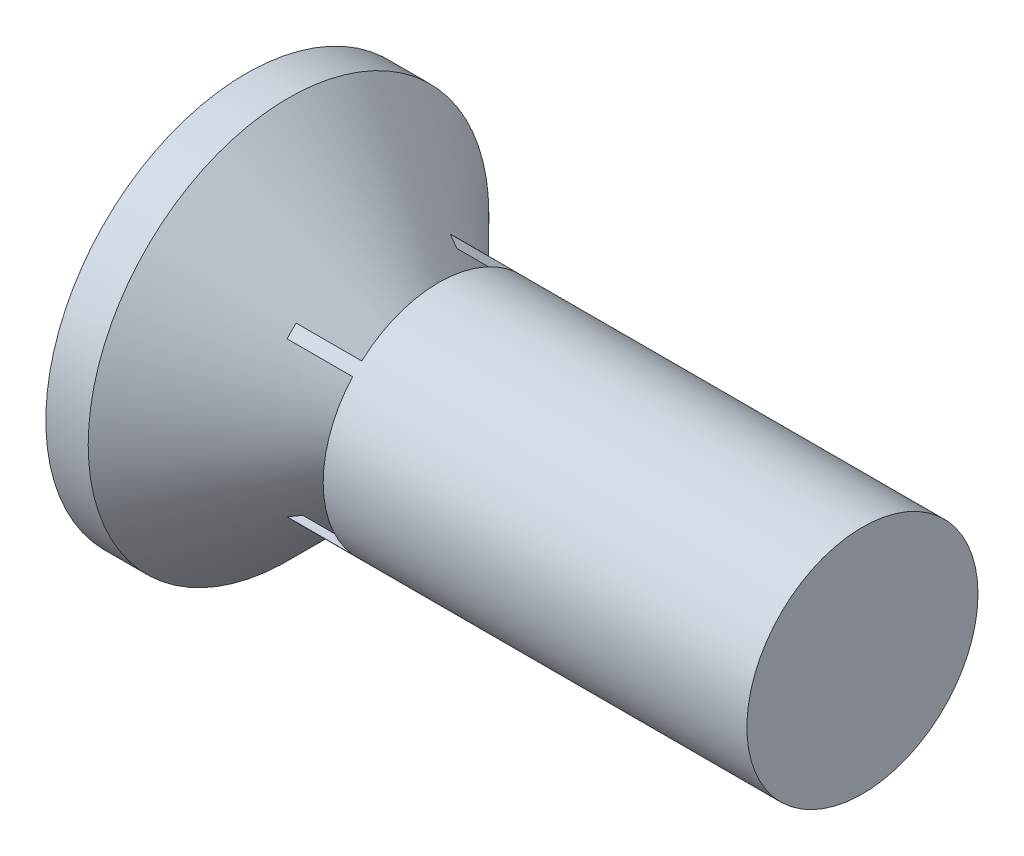
ISO-10303-21;
HEADER;
FILE_DESCRIPTION(('STEP AP214'),'2;1');
FILE_NAME('part.step','',(''),(''),'','','');
FILE_SCHEMA(('AUTOMOTIVE_DESIGN { 1 0 10303 214 1 1 1 1 }'));
ENDSEC;
DATA;
#1=APPLICATION_CONTEXT('core data for automotive mechanical design processes');
#2=APPLICATION_PROTOCOL_DEFINITION('international standard','automotive_design',2000,#1);
#3=PRODUCT_CONTEXT('',#1,'mechanical');
#4=PRODUCT('Part','Part','',(#3));
#5=PRODUCT_RELATED_PRODUCT_CATEGORY('part','',(#4));
#6=PRODUCT_DEFINITION_FORMATION('','',#4);
#7=PRODUCT_DEFINITION_CONTEXT('part definition',#1,'design');
#8=PRODUCT_DEFINITION('design','',#6,#7);
#9=PRODUCT_DEFINITION_SHAPE('','',#8);
#10=(LENGTH_UNIT() NAMED_UNIT(*) SI_UNIT(.MILLI.,.METRE.));
#11=(NAMED_UNIT(*) PLANE_ANGLE_UNIT() SI_UNIT($,.RADIAN.));
#12=(NAMED_UNIT(*) SI_UNIT($,.STERADIAN.) SOLID_ANGLE_UNIT());
#13=UNCERTAINTY_MEASURE_WITH_UNIT(LENGTH_MEASURE(1.E-05),#10,'distance_accuracy_value','');
#14=(GEOMETRIC_REPRESENTATION_CONTEXT(3) GLOBAL_UNCERTAINTY_ASSIGNED_CONTEXT((#13)) GLOBAL_UNIT_ASSIGNED_CONTEXT((#10,
#11,#12)) REPRESENTATION_CONTEXT('',''));
#15=CARTESIAN_POINT('',(0.,0.,0.));
#16=DIRECTION('',(0.,0.,1.));
#17=DIRECTION('',(1.,0.,0.));
#18=AXIS2_PLACEMENT_3D('',#15,#16,#17);
#19=CARTESIAN_POINT('',(2.5,1.,1.));
#20=DIRECTION('',(1.,0.,0.));
#21=DIRECTION('',(0.,0.,-1.));
#22=AXIS2_PLACEMENT_3D('',#19,#20,#21);
#23=PLANE('',#22);
#24=DIRECTION('',(0.,1.,0.));
#25=VECTOR('',#24,1.);
#26=CARTESIAN_POINT('',(2.5,1.,0.999999999999999));
#27=LINE('',#26,#25);
#28=CARTESIAN_POINT('',(2.5,-1.00000000000001,0.999999999999999));
#29=VERTEX_POINT('',#28);
#30=CARTESIAN_POINT('',(2.5,-1.1180339887499,0.999999999999999));
#31=VERTEX_POINT('',#30);
#32=EDGE_CURVE('E578',#29,#31,#27,.F.);
#33=ORIENTED_EDGE('',*,*,#32,.F.);
#34=DIRECTION('',(0.,0.,-1.));
#35=VECTOR('',#34,1.);
#36=CARTESIAN_POINT('',(2.5,-1.,1.));
#37=LINE('',#36,#35);
#38=CARTESIAN_POINT('',(2.5,-1.,1.11803398874989));
#39=VERTEX_POINT('',#38);
#40=EDGE_CURVE('E581',#39,#29,#37,.T.);
#41=ORIENTED_EDGE('',*,*,#40,.F.);
#42=CARTESIAN_POINT('',(2.5,0.,0.));
#43=DIRECTION('',(1.,0.,0.));
#44=DIRECTION('',(0.,0.,-1.));
#45=AXIS2_PLACEMENT_3D('',#42,#43,#44);
#46=CIRCLE('',#45,1.5);
#47=CARTESIAN_POINT('',(2.5,1.,1.11803398874989));
#48=VERTEX_POINT('',#47);
#49=EDGE_CURVE('E348',#48,#39,#46,.T.);
#50=ORIENTED_EDGE('',*,*,#49,.F.);
#51=DIRECTION('',(0.,0.,-1.));
#52=VECTOR('',#51,1.);
#53=CARTESIAN_POINT('',(2.5,1.,1.));
#54=LINE('',#53,#52);
#55=CARTESIAN_POINT('',(2.5,1.,1.00000000000021));
#56=VERTEX_POINT('',#55);
#57=EDGE_CURVE('E585',#56,#48,#54,.F.);
#58=ORIENTED_EDGE('',*,*,#57,.F.);
#59=DIRECTION('',(0.,1.,0.));
#60=VECTOR('',#59,1.);
#61=CARTESIAN_POINT('',(2.5,1.,1.));
#62=LINE('',#61,#60);
#63=CARTESIAN_POINT('',(2.5,1.11803398874989,1.));
#64=VERTEX_POINT('',#63);
#65=EDGE_CURVE('E590',#64,#56,#62,.F.);
#66=ORIENTED_EDGE('',*,*,#65,.F.);
#67=CARTESIAN_POINT('',(2.5,0.,0.));
#68=DIRECTION('',(1.,0.,0.));
#69=DIRECTION('',(0.,0.,-1.));
#70=AXIS2_PLACEMENT_3D('',#67,#68,#69);
#71=CIRCLE('',#70,1.5);
#72=CARTESIAN_POINT('',(2.5,1.11803398874989,-1.));
#73=VERTEX_POINT('',#72);
#74=EDGE_CURVE('E353',#73,#64,#71,.T.);
#75=ORIENTED_EDGE('',*,*,#74,.F.);
#76=DIRECTION('',(0.,1.,0.));
#77=VECTOR('',#76,1.);
#78=CARTESIAN_POINT('',(2.5,1.,-1.));
#79=LINE('',#78,#77);
#80=CARTESIAN_POINT('',(2.5,1.00000000000013,-1.));
#81=VERTEX_POINT('',#80);
#82=EDGE_CURVE('E594',#81,#73,#79,.T.);
#83=ORIENTED_EDGE('',*,*,#82,.F.);
#84=DIRECTION('',(0.,0.,-1.));
#85=VECTOR('',#84,1.);
#86=CARTESIAN_POINT('',(2.5,1.,1.));
#87=LINE('',#86,#85);
#88=CARTESIAN_POINT('',(2.5,1.,-1.11803398874989));
#89=VERTEX_POINT('',#88);
#90=EDGE_CURVE('E598',#89,#81,#87,.F.);
#91=ORIENTED_EDGE('',*,*,#90,.F.);
#92=CARTESIAN_POINT('',(2.5,0.,0.));
#93=DIRECTION('',(1.,0.,0.));
#94=DIRECTION('',(0.,0.,-1.));
#95=AXIS2_PLACEMENT_3D('',#92,#93,#94);
#96=CIRCLE('',#95,1.5);
#97=CARTESIAN_POINT('',(2.5,-1.,-1.11803398874989));
#98=VERTEX_POINT('',#97);
#99=EDGE_CURVE('E358',#98,#89,#96,.T.);
#100=ORIENTED_EDGE('',*,*,#99,.F.);
#101=DIRECTION('',(0.,0.,1.));
#102=VECTOR('',#101,1.);
#103=CARTESIAN_POINT('',(2.5,-1.,-1.));
#104=LINE('',#103,#102);
#105=CARTESIAN_POINT('',(2.5,-1.,-1.));
#106=VERTEX_POINT('',#105);
#107=EDGE_CURVE('E362',#106,#98,#104,.F.);
#108=ORIENTED_EDGE('',*,*,#107,.F.);
#109=DIRECTION('',(0.,-1.,0.));
#110=VECTOR('',#109,1.);
#111=CARTESIAN_POINT('',(2.5,-1.,-1.));
#112=LINE('',#111,#110);
#113=CARTESIAN_POINT('',(2.5,-1.11803398874989,-1.));
#114=VERTEX_POINT('',#113);
#115=EDGE_CURVE('E580',#114,#106,#112,.F.);
#116=ORIENTED_EDGE('',*,*,#115,.F.);
#117=CARTESIAN_POINT('',(2.5,0.,0.));
#118=DIRECTION('',(1.,0.,0.));
#119=DIRECTION('',(0.,0.,-1.));
#120=AXIS2_PLACEMENT_3D('',#117,#118,#119);
#121=CIRCLE('',#120,1.5);
#122=EDGE_CURVE('E343',#31,#114,#121,.T.);
#123=ORIENTED_EDGE('',*,*,#122,.F.);
#124=EDGE_LOOP('',(#33,#41,#50,#58,#66,#75,#83,#91,#100,#108,#116,#123));
#125=FACE_BOUND('',#124,.T.);
#126=DIRECTION('',(0.,-1.,0.));
#127=VECTOR('',#126,1.);
#128=CARTESIAN_POINT('',(2.5,1.,-0.156624327025932));
#129=LINE('',#128,#127);
#130=CARTESIAN_POINT('',(2.5,0.156624327025931,-0.156624327025932));
#131=VERTEX_POINT('',#130);
#132=CARTESIAN_POINT('',(2.5,-0.156624327025932,-0.156624327025932));
#133=VERTEX_POINT('',#132);
#134=EDGE_CURVE('E11',#131,#133,#129,.T.);
#135=ORIENTED_EDGE('',*,*,#134,.F.);
#136=DIRECTION('',(0.,0.,-1.));
#137=VECTOR('',#136,1.);
#138=CARTESIAN_POINT('',(2.5,0.156624327025931,1.));
#139=LINE('',#138,#137);
#140=CARTESIAN_POINT('',(2.5,0.156624327025931,0.156624327025932));
#141=VERTEX_POINT('',#140);
#142=EDGE_CURVE('E26',#141,#131,#139,.T.);
#143=ORIENTED_EDGE('',*,*,#142,.F.);
#144=DIRECTION('',(0.,1.,0.));
#145=VECTOR('',#144,1.);
#146=CARTESIAN_POINT('',(2.5,1.,0.156624327025932));
#147=LINE('',#146,#145);
#148=CARTESIAN_POINT('',(2.5,-0.156624327025932,0.156624327025931));
#149=VERTEX_POINT('',#148);
#150=EDGE_CURVE('E334',#149,#141,#147,.T.);
#151=ORIENTED_EDGE('',*,*,#150,.F.);
#152=DIRECTION('',(0.,0.,1.));
#153=VECTOR('',#152,1.);
#154=CARTESIAN_POINT('',(2.5,-0.156624327025932,1.));
#155=LINE('',#154,#153);
#156=EDGE_CURVE('E332',#133,#149,#155,.T.);
#157=ORIENTED_EDGE('',*,*,#156,.F.);
#158=EDGE_LOOP('',(#135,#143,#151,#157));
#159=FACE_BOUND('',#158,.T.);
#160=ADVANCED_FACE('F16',(#125,#159),#23,.F.);
#161=CARTESIAN_POINT('',(62.2289156626506,0.,0.));
#162=DIRECTION('',(1.,0.,0.));
#163=DIRECTION('',(0.,1.,0.));
#164=AXIS2_PLACEMENT_3D('',#161,#162,#163);
#165=CYLINDRICAL_SURFACE('',#164,0.999999999999985);
#166=CARTESIAN_POINT('',(2.77128129211021,0.,0.));
#167=DIRECTION('',(-0.500000000000001,0.866025403784438,0.));
#168=DIRECTION('',(0.866025403784438,0.500000000000001,0.));
#169=AXIS2_PLACEMENT_3D('',#166,#167,#168);
#170=ELLIPSE('',#169,1.99999999999997,0.999999999999985);
#171=CARTESIAN_POINT('',(1.54653642071864,-0.707106781186532,0.707106781186532));
#172=VERTEX_POINT('',#171);
#173=CARTESIAN_POINT('',(1.2,-0.907179676972447,0.420743429762272));
#174=VERTEX_POINT('',#173);
#175=EDGE_CURVE('E215',#172,#174,#170,.F.);
#176=ORIENTED_EDGE('',*,*,#175,.F.);
#177=CARTESIAN_POINT('',(2.7712812921102,0.,0.));
#178=DIRECTION('',(-0.500000000000001,0.,-0.866025403784438));
#179=DIRECTION('',(0.866025403784438,0.,-0.500000000000001));
#180=AXIS2_PLACEMENT_3D('',#177,#178,#179);
#181=ELLIPSE('',#180,1.99999999999997,0.999999999999985);
#182=CARTESIAN_POINT('',(1.2,-0.420743429762281,0.907179676972448));
#183=VERTEX_POINT('',#182);
#184=EDGE_CURVE('E169',#183,#172,#181,.F.);
#185=ORIENTED_EDGE('',*,*,#184,.F.);
#186=CARTESIAN_POINT('',(1.2,0.,0.));
#187=DIRECTION('',(1.,0.,0.));
#188=DIRECTION('',(0.,1.,0.));
#189=AXIS2_PLACEMENT_3D('',#186,#187,#188);
#190=CIRCLE('',#189,0.999999999999985);
#191=EDGE_CURVE('E159',#174,#183,#190,.F.);
#192=ORIENTED_EDGE('',*,*,#191,.F.);
#193=EDGE_LOOP('',(#176,#185,#192));
#194=FACE_BOUND('',#193,.T.);
#195=ADVANCED_FACE('F18',(#194),#165,.T.);
#196=CARTESIAN_POINT('',(62.2289156626506,0.,0.));
#197=DIRECTION('',(1.,0.,0.));
#198=DIRECTION('',(0.,1.,0.));
#199=AXIS2_PLACEMENT_3D('',#196,#197,#198);
#200=CYLINDRICAL_SURFACE('',#199,0.999999999999985);
#201=CARTESIAN_POINT('',(2.7712812921102,0.,0.));
#202=DIRECTION('',(-0.500000000000001,0.,0.866025403784438));
#203=DIRECTION('',(0.866025403784438,0.,0.500000000000001));
#204=AXIS2_PLACEMENT_3D('',#201,#202,#203);
#205=ELLIPSE('',#204,1.99999999999997,0.999999999999985);
#206=CARTESIAN_POINT('',(1.54653642071864,-0.707106781186532,-0.707106781186533));
#207=VERTEX_POINT('',#206);
#208=CARTESIAN_POINT('',(1.2,-0.420743429762281,-0.907179676972448));
#209=VERTEX_POINT('',#208);
#210=EDGE_CURVE('E195',#207,#209,#205,.F.);
#211=ORIENTED_EDGE('',*,*,#210,.F.);
#212=CARTESIAN_POINT('',(2.77128129211021,0.,0.));
#213=DIRECTION('',(-0.500000000000001,0.866025403784438,0.));
#214=DIRECTION('',(0.866025403784438,0.500000000000001,0.));
#215=AXIS2_PLACEMENT_3D('',#212,#213,#214);
#216=ELLIPSE('',#215,1.99999999999997,0.999999999999985);
#217=CARTESIAN_POINT('',(1.2,-0.907179676972447,-0.420743429762272));
#218=VERTEX_POINT('',#217);
#219=EDGE_CURVE('E173',#218,#207,#216,.F.);
#220=ORIENTED_EDGE('',*,*,#219,.F.);
#221=CARTESIAN_POINT('',(1.2,0.,0.));
#222=DIRECTION('',(1.,0.,0.));
#223=DIRECTION('',(0.,1.,0.));
#224=AXIS2_PLACEMENT_3D('',#221,#222,#223);
#225=CIRCLE('',#224,0.999999999999985);
#226=EDGE_CURVE('E178',#209,#218,#225,.F.);
#227=ORIENTED_EDGE('',*,*,#226,.F.);
#228=EDGE_LOOP('',(#211,#220,#227));
#229=FACE_BOUND('',#228,.T.);
#230=ADVANCED_FACE('F416',(#229),#200,.T.);
#231=CARTESIAN_POINT('',(62.2289156626506,0.,0.));
#232=DIRECTION('',(1.,0.,0.));
#233=DIRECTION('',(0.,1.,0.));
#234=AXIS2_PLACEMENT_3D('',#231,#232,#233);
#235=CYLINDRICAL_SURFACE('',#234,0.999999999999985);
#236=CARTESIAN_POINT('',(2.77128129211018,0.,0.));
#237=DIRECTION('',(-0.500000000000001,-0.866025403784438,0.));
#238=DIRECTION('',(0.866025403784438,-0.500000000000001,0.));
#239=AXIS2_PLACEMENT_3D('',#236,#237,#238);
#240=ELLIPSE('',#239,1.99999999999997,0.999999999999985);
#241=CARTESIAN_POINT('',(1.2,0.907179676972446,0.420743429762313));
#242=VERTEX_POINT('',#241);
#243=CARTESIAN_POINT('',(1.54653642071862,0.70710678118654,0.707106781186542));
#244=VERTEX_POINT('',#243);
#245=EDGE_CURVE('E149',#242,#244,#240,.F.);
#246=ORIENTED_EDGE('',*,*,#245,.F.);
#247=CARTESIAN_POINT('',(1.2,0.,0.));
#248=DIRECTION('',(1.,0.,0.));
#249=DIRECTION('',(0.,1.,0.));
#250=AXIS2_PLACEMENT_3D('',#247,#248,#249);
#251=CIRCLE('',#250,0.999999999999985);
#252=CARTESIAN_POINT('',(1.2,0.420743429762299,0.907179676972448));
#253=VERTEX_POINT('',#252);
#254=EDGE_CURVE('E20',#253,#242,#251,.F.);
#255=ORIENTED_EDGE('',*,*,#254,.F.);
#256=CARTESIAN_POINT('',(2.7712812921102,0.,0.));
#257=DIRECTION('',(-0.500000000000001,0.,-0.866025403784438));
#258=DIRECTION('',(0.866025403784438,0.,-0.500000000000001));
#259=AXIS2_PLACEMENT_3D('',#256,#257,#258);
#260=ELLIPSE('',#259,1.99999999999997,0.999999999999985);
#261=EDGE_CURVE('E146',#244,#253,#260,.F.);
#262=ORIENTED_EDGE('',*,*,#261,.F.);
#263=EDGE_LOOP('',(#246,#255,#262));
#264=FACE_BOUND('',#263,.T.);
#265=ADVANCED_FACE('F144',(#264),#235,.T.);
#266=CARTESIAN_POINT('',(62.2289156626506,0.,0.));
#267=DIRECTION('',(1.,0.,0.));
#268=DIRECTION('',(0.,1.,0.));
#269=AXIS2_PLACEMENT_3D('',#266,#267,#268);
#270=CYLINDRICAL_SURFACE('',#269,0.999999999999985);
#271=CARTESIAN_POINT('',(2.77128129211018,0.,0.));
#272=DIRECTION('',(-0.500000000000001,-0.866025403784438,0.));
#273=DIRECTION('',(0.866025403784438,-0.500000000000001,0.));
#274=AXIS2_PLACEMENT_3D('',#271,#272,#273);
#275=ELLIPSE('',#274,1.99999999999997,0.999999999999985);
#276=CARTESIAN_POINT('',(1.54653642071862,0.707106781186541,-0.707106781186543));
#277=VERTEX_POINT('',#276);
#278=CARTESIAN_POINT('',(1.2,0.907179676972446,-0.420743429762313));
#279=VERTEX_POINT('',#278);
#280=EDGE_CURVE('E487',#277,#279,#275,.F.);
#281=ORIENTED_EDGE('',*,*,#280,.F.);
#282=CARTESIAN_POINT('',(2.7712812921102,0.,0.));
#283=DIRECTION('',(-0.500000000000001,0.,0.866025403784438));
#284=DIRECTION('',(0.866025403784438,0.,0.500000000000001));
#285=AXIS2_PLACEMENT_3D('',#282,#283,#284);
#286=ELLIPSE('',#285,1.99999999999997,0.999999999999985);
#287=CARTESIAN_POINT('',(1.2,0.420743429762299,-0.907179676972448));
#288=VERTEX_POINT('',#287);
#289=EDGE_CURVE('E192',#288,#277,#286,.F.);
#290=ORIENTED_EDGE('',*,*,#289,.F.);
#291=CARTESIAN_POINT('',(1.2,0.,0.));
#292=DIRECTION('',(1.,0.,0.));
#293=DIRECTION('',(0.,1.,0.));
#294=AXIS2_PLACEMENT_3D('',#291,#292,#293);
#295=CIRCLE('',#294,0.999999999999985);
#296=EDGE_CURVE('E153',#279,#288,#295,.F.);
#297=ORIENTED_EDGE('',*,*,#296,.F.);
#298=EDGE_LOOP('',(#281,#290,#297));
#299=FACE_BOUND('',#298,.T.);
#300=ADVANCED_FACE('F668',(#299),#270,.T.);
#301=CARTESIAN_POINT('',(1.2,0.999999999999994,0.));
#302=DIRECTION('',(-1.,0.,0.));
#303=DIRECTION('',(0.,-1.,0.));
#304=AXIS2_PLACEMENT_3D('',#301,#302,#303);
#305=PLANE('',#304);
#306=ORIENTED_EDGE('',*,*,#191,.T.);
#307=DIRECTION('',(0.,1.,0.));
#308=VECTOR('',#307,1.);
#309=CARTESIAN_POINT('',(1.2,1.,0.907179676972447));
#310=LINE('',#309,#308);
#311=EDGE_CURVE('E156',#253,#183,#310,.F.);
#312=ORIENTED_EDGE('',*,*,#311,.F.);
#313=ORIENTED_EDGE('',*,*,#254,.T.);
#314=DIRECTION('',(0.,0.,1.));
#315=VECTOR('',#314,1.);
#316=CARTESIAN_POINT('',(1.2,0.907179676972447,-1.));
#317=LINE('',#316,#315);
#318=EDGE_CURVE('E185',#279,#242,#317,.T.);
#319=ORIENTED_EDGE('',*,*,#318,.F.);
#320=ORIENTED_EDGE('',*,*,#296,.T.);
#321=DIRECTION('',(0.,1.,0.));
#322=VECTOR('',#321,1.);
#323=CARTESIAN_POINT('',(1.2,1.,-0.907179676972447));
#324=LINE('',#323,#322);
#325=EDGE_CURVE('E183',#209,#288,#324,.T.);
#326=ORIENTED_EDGE('',*,*,#325,.F.);
#327=ORIENTED_EDGE('',*,*,#226,.T.);
#328=DIRECTION('',(0.,0.,1.));
#329=VECTOR('',#328,1.);
#330=CARTESIAN_POINT('',(1.2,-0.907179676972447,-1.));
#331=LINE('',#330,#329);
#332=EDGE_CURVE('E211',#174,#218,#331,.F.);
#333=ORIENTED_EDGE('',*,*,#332,.F.);
#334=EDGE_LOOP('',(#306,#312,#313,#319,#320,#326,#327,#333));
#335=FACE_BOUND('',#334,.T.);
#336=ADVANCED_FACE('F157',(#335),#305,.T.);
#337=CARTESIAN_POINT('',(2.5,1.,1.));
#338=DIRECTION('',(0.,0.,-1.));
#339=DIRECTION('',(0.,1.,0.));
#340=AXIS2_PLACEMENT_3D('',#337,#338,#339);
#341=PLANE('',#340);
#342=DIRECTION('',(1.,0.,0.));
#343=VECTOR('',#342,1.);
#344=CARTESIAN_POINT('',(2.5,1.,1.));
#345=LINE('',#344,#343);
#346=CARTESIAN_POINT('',(0.,1.,1.));
#347=VERTEX_POINT('',#346);
#348=CARTESIAN_POINT('',(1.03923048454132,0.999999999999999,1.));
#349=VERTEX_POINT('',#348);
#350=EDGE_CURVE('E176',#347,#349,#345,.T.);
#351=ORIENTED_EDGE('',*,*,#350,.F.);
#352=DIRECTION('',(0.,1.,0.));
#353=VECTOR('',#352,1.);
#354=CARTESIAN_POINT('',(0.,2.6,1.));
#355=LINE('',#354,#353);
#356=CARTESIAN_POINT('',(0.,1.6,1.));
#357=VERTEX_POINT('',#356);
#358=EDGE_CURVE('E325',#357,#347,#355,.F.);
#359=ORIENTED_EDGE('',*,*,#358,.F.);
#360=DIRECTION('',(0.866025403784438,-0.500000000000001,0.));
#361=VECTOR('',#360,1.);
#362=CARTESIAN_POINT('',(0.,1.6,1.));
#363=LINE('',#362,#361);
#364=EDGE_CURVE('E226',#349,#357,#363,.F.);
#365=ORIENTED_EDGE('',*,*,#364,.F.);
#366=EDGE_LOOP('',(#351,#359,#365));
#367=FACE_BOUND('',#366,.T.);
#368=ADVANCED_FACE('F675',(#367),#341,.T.);
#369=CARTESIAN_POINT('',(2.5,1.,1.));
#370=DIRECTION('',(0.,-1.,0.));
#371=DIRECTION('',(0.,0.,-1.));
#372=AXIS2_PLACEMENT_3D('',#369,#370,#371);
#373=PLANE('',#372);
#374=DIRECTION('',(-0.866025403784438,0.,0.500000000000001));
#375=VECTOR('',#374,1.);
#376=CARTESIAN_POINT('',(0.,1.,1.6));
#377=LINE('',#376,#375);
#378=CARTESIAN_POINT('',(0.,1.,1.6));
#379=VERTEX_POINT('',#378);
#380=EDGE_CURVE('E167',#379,#349,#377,.F.);
#381=ORIENTED_EDGE('',*,*,#380,.F.);
#382=DIRECTION('',(0.,0.,1.));
#383=VECTOR('',#382,1.);
#384=CARTESIAN_POINT('',(0.,1.,0.));
#385=LINE('',#384,#383);
#386=EDGE_CURVE('E316',#347,#379,#385,.T.);
#387=ORIENTED_EDGE('',*,*,#386,.F.);
#388=ORIENTED_EDGE('',*,*,#350,.T.);
#389=EDGE_LOOP('',(#381,#387,#388));
#390=FACE_BOUND('',#389,.T.);
#391=ADVANCED_FACE('F712',(#390),#373,.T.);
#392=CARTESIAN_POINT('',(0.,1.,1.6));
#393=DIRECTION('',(-0.500000000000001,0.,-0.866025403784438));
#394=DIRECTION('',(-0.866025403784438,0.,0.500000000000001));
#395=AXIS2_PLACEMENT_3D('',#392,#393,#394);
#396=PLANE('',#395);
#397=ORIENTED_EDGE('',*,*,#261,.T.);
#398=ORIENTED_EDGE('',*,*,#311,.T.);
#399=ORIENTED_EDGE('',*,*,#184,.T.);
#400=DIRECTION('',(0.774596669241482,0.447213595499959,-0.447213595499959));
#401=VECTOR('',#400,1.);
#402=CARTESIAN_POINT('',(1.03923048454132,-1.,1.));
#403=LINE('',#402,#401);
#404=CARTESIAN_POINT('',(1.03923048454132,-1.,0.999999999999999));
#405=VERTEX_POINT('',#404);
#406=EDGE_CURVE('E216',#405,#172,#403,.T.);
#407=ORIENTED_EDGE('',*,*,#406,.F.);
#408=DIRECTION('',(0.866025403784438,0.,-0.500000000000001));
#409=VECTOR('',#408,1.);
#410=CARTESIAN_POINT('',(0.,-1.,1.6));
#411=LINE('',#410,#409);
#412=CARTESIAN_POINT('',(0.,-1.,1.6));
#413=VERTEX_POINT('',#412);
#414=EDGE_CURVE('E161',#413,#405,#411,.T.);
#415=ORIENTED_EDGE('',*,*,#414,.F.);
#416=DIRECTION('',(0.,1.,0.));
#417=VECTOR('',#416,1.);
#418=CARTESIAN_POINT('',(0.,2.6,1.6));
#419=LINE('',#418,#417);
#420=EDGE_CURVE('E311',#379,#413,#419,.F.);
#421=ORIENTED_EDGE('',*,*,#420,.F.);
#422=ORIENTED_EDGE('',*,*,#380,.T.);
#423=DIRECTION('',(-0.774596669241483,0.447213595499959,0.447213595499958));
#424=VECTOR('',#423,1.);
#425=CARTESIAN_POINT('',(1.54653642071862,0.707106781186541,0.707106781186542));
#426=LINE('',#425,#424);
#427=EDGE_CURVE('E166',#244,#349,#426,.T.);
#428=ORIENTED_EDGE('',*,*,#427,.F.);
#429=EDGE_LOOP('',(#397,#398,#399,#407,#415,#421,#422,#428));
#430=FACE_BOUND('',#429,.T.);
#431=ADVANCED_FACE('F163',(#430),#396,.T.);
#432=CARTESIAN_POINT('',(2.5,-1.,0.999999999999999));
#433=DIRECTION('',(0.,1.,0.));
#434=DIRECTION('',(0.,0.,1.));
#435=AXIS2_PLACEMENT_3D('',#432,#433,#434);
#436=PLANE('',#435);
#437=DIRECTION('',(1.,0.,0.));
#438=VECTOR('',#437,1.);
#439=CARTESIAN_POINT('',(2.5,-1.,0.999999999999999));
#440=LINE('',#439,#438);
#441=CARTESIAN_POINT('',(0.,-1.,0.999999999999999));
#442=VERTEX_POINT('',#441);
#443=EDGE_CURVE('E295',#442,#405,#440,.T.);
#444=ORIENTED_EDGE('',*,*,#443,.F.);
#445=DIRECTION('',(0.,0.,1.));
#446=VECTOR('',#445,1.);
#447=CARTESIAN_POINT('',(0.,-1.,0.));
#448=LINE('',#447,#446);
#449=EDGE_CURVE('E302',#413,#442,#448,.F.);
#450=ORIENTED_EDGE('',*,*,#449,.F.);
#451=ORIENTED_EDGE('',*,*,#414,.T.);
#452=EDGE_LOOP('',(#444,#450,#451));
#453=FACE_BOUND('',#452,.T.);
#454=ADVANCED_FACE('F729',(#453),#436,.T.);
#455=CARTESIAN_POINT('',(2.5,-1.,0.999999999999999));
#456=DIRECTION('',(0.,0.,-1.));
#457=DIRECTION('',(0.,1.,0.));
#458=AXIS2_PLACEMENT_3D('',#455,#456,#457);
#459=PLANE('',#458);
#460=DIRECTION('',(-0.866025403784438,-0.500000000000001,0.));
#461=VECTOR('',#460,1.);
#462=CARTESIAN_POINT('',(0.,-1.6,0.999999999999999));
#463=LINE('',#462,#461);
#464=CARTESIAN_POINT('',(0.,-1.6,0.999999999999999));
#465=VERTEX_POINT('',#464);
#466=EDGE_CURVE('E219',#465,#405,#463,.F.);
#467=ORIENTED_EDGE('',*,*,#466,.F.);
#468=DIRECTION('',(0.,1.,0.));
#469=VECTOR('',#468,1.);
#470=CARTESIAN_POINT('',(0.,2.6,0.999999999999999));
#471=LINE('',#470,#469);
#472=EDGE_CURVE('E288',#442,#465,#471,.F.);
#473=ORIENTED_EDGE('',*,*,#472,.F.);
#474=ORIENTED_EDGE('',*,*,#443,.T.);
#475=EDGE_LOOP('',(#467,#473,#474));
#476=FACE_BOUND('',#475,.T.);
#477=ADVANCED_FACE('F738',(#476),#459,.T.);
#478=CARTESIAN_POINT('',(0.,-1.6,-1.));
#479=DIRECTION('',(-0.500000000000001,0.866025403784438,0.));
#480=DIRECTION('',(-0.866025403784438,-0.500000000000001,0.));
#481=AXIS2_PLACEMENT_3D('',#478,#479,#480);
#482=PLANE('',#481);
#483=ORIENTED_EDGE('',*,*,#175,.T.);
#484=ORIENTED_EDGE('',*,*,#332,.T.);
#485=ORIENTED_EDGE('',*,*,#219,.T.);
#486=DIRECTION('',(0.774596669241483,0.447213595499958,0.447213595499959));
#487=VECTOR('',#486,1.);
#488=CARTESIAN_POINT('',(1.03923048454132,-1.,-1.));
#489=LINE('',#488,#487);
#490=CARTESIAN_POINT('',(1.03923048454132,-1.,-1.));
#491=VERTEX_POINT('',#490);
#492=EDGE_CURVE('E201',#491,#207,#489,.T.);
#493=ORIENTED_EDGE('',*,*,#492,.F.);
#494=DIRECTION('',(0.866025403784438,0.500000000000001,0.));
#495=VECTOR('',#494,1.);
#496=CARTESIAN_POINT('',(0.,-1.6,-1.));
#497=LINE('',#496,#495);
#498=CARTESIAN_POINT('',(0.,-1.6,-1.));
#499=VERTEX_POINT('',#498);
#500=EDGE_CURVE('E214',#499,#491,#497,.T.);
#501=ORIENTED_EDGE('',*,*,#500,.F.);
#502=DIRECTION('',(0.,0.,1.));
#503=VECTOR('',#502,1.);
#504=CARTESIAN_POINT('',(0.,-1.6,0.));
#505=LINE('',#504,#503);
#506=EDGE_CURVE('E283',#465,#499,#505,.F.);
#507=ORIENTED_EDGE('',*,*,#506,.F.);
#508=ORIENTED_EDGE('',*,*,#466,.T.);
#509=ORIENTED_EDGE('',*,*,#406,.T.);
#510=EDGE_LOOP('',(#483,#484,#485,#493,#501,#507,#508,#509));
#511=FACE_BOUND('',#510,.T.);
#512=ADVANCED_FACE('F493',(#511),#482,.T.);
#513=CARTESIAN_POINT('',(2.5,-1.,-1.));
#514=DIRECTION('',(0.,0.,1.));
#515=DIRECTION('',(0.,-1.,0.));
#516=AXIS2_PLACEMENT_3D('',#513,#514,#515);
#517=PLANE('',#516);
#518=DIRECTION('',(1.,0.,0.));
#519=VECTOR('',#518,1.);
#520=CARTESIAN_POINT('',(2.5,-1.,-1.));
#521=LINE('',#520,#519);
#522=CARTESIAN_POINT('',(0.,-1.,-1.));
#523=VERTEX_POINT('',#522);
#524=EDGE_CURVE('E267',#523,#491,#521,.T.);
#525=ORIENTED_EDGE('',*,*,#524,.F.);
#526=DIRECTION('',(0.,1.,0.));
#527=VECTOR('',#526,1.);
#528=CARTESIAN_POINT('',(0.,2.6,-1.));
#529=LINE('',#528,#527);
#530=EDGE_CURVE('E274',#499,#523,#529,.T.);
#531=ORIENTED_EDGE('',*,*,#530,.F.);
#532=ORIENTED_EDGE('',*,*,#500,.T.);
#533=EDGE_LOOP('',(#525,#531,#532));
#534=FACE_BOUND('',#533,.T.);
#535=ADVANCED_FACE('F757',(#534),#517,.T.);
#536=CARTESIAN_POINT('',(2.5,-1.,-1.));
#537=DIRECTION('',(0.,1.,0.));
#538=DIRECTION('',(0.,0.,1.));
#539=AXIS2_PLACEMENT_3D('',#536,#537,#538);
#540=PLANE('',#539);
#541=DIRECTION('',(0.866025403784438,0.,0.500000000000001));
#542=VECTOR('',#541,1.);
#543=CARTESIAN_POINT('',(0.,-1.,-1.6));
#544=LINE('',#543,#542);
#545=CARTESIAN_POINT('',(0.,-1.,-1.6));
#546=VERTEX_POINT('',#545);
#547=EDGE_CURVE('E208',#546,#491,#544,.T.);
#548=ORIENTED_EDGE('',*,*,#547,.F.);
#549=DIRECTION('',(0.,0.,1.));
#550=VECTOR('',#549,1.);
#551=CARTESIAN_POINT('',(0.,-1.,0.));
#552=LINE('',#551,#550);
#553=EDGE_CURVE('E260',#523,#546,#552,.F.);
#554=ORIENTED_EDGE('',*,*,#553,.F.);
#555=ORIENTED_EDGE('',*,*,#524,.T.);
#556=EDGE_LOOP('',(#548,#554,#555));
#557=FACE_BOUND('',#556,.T.);
#558=ADVANCED_FACE('F508',(#557),#540,.T.);
#559=CARTESIAN_POINT('',(0.,1.,-1.6));
#560=DIRECTION('',(-0.500000000000001,0.,0.866025403784438));
#561=DIRECTION('',(0.866025403784438,0.,0.500000000000001));
#562=AXIS2_PLACEMENT_3D('',#559,#560,#561);
#563=PLANE('',#562);
#564=ORIENTED_EDGE('',*,*,#210,.T.);
#565=ORIENTED_EDGE('',*,*,#325,.T.);
#566=ORIENTED_EDGE('',*,*,#289,.T.);
#567=DIRECTION('',(0.774596669241483,-0.447213595499959,0.447213595499959));
#568=VECTOR('',#567,1.);
#569=CARTESIAN_POINT('',(1.03923048454132,1.,-1.));
#570=LINE('',#569,#568);
#571=CARTESIAN_POINT('',(1.03923048454132,1.,-1.));
#572=VERTEX_POINT('',#571);
#573=EDGE_CURVE('E225',#572,#277,#570,.T.);
#574=ORIENTED_EDGE('',*,*,#573,.F.);
#575=DIRECTION('',(0.866025403784438,0.,0.500000000000001));
#576=VECTOR('',#575,1.);
#577=CARTESIAN_POINT('',(0.,1.,-1.6));
#578=LINE('',#577,#576);
#579=CARTESIAN_POINT('',(0.,1.,-1.6));
#580=VERTEX_POINT('',#579);
#581=EDGE_CURVE('E196',#580,#572,#578,.T.);
#582=ORIENTED_EDGE('',*,*,#581,.F.);
#583=DIRECTION('',(0.,1.,0.));
#584=VECTOR('',#583,1.);
#585=CARTESIAN_POINT('',(0.,2.6,-1.6));
#586=LINE('',#585,#584);
#587=EDGE_CURVE('E255',#546,#580,#586,.T.);
#588=ORIENTED_EDGE('',*,*,#587,.F.);
#589=ORIENTED_EDGE('',*,*,#547,.T.);
#590=ORIENTED_EDGE('',*,*,#492,.T.);
#591=EDGE_LOOP('',(#564,#565,#566,#574,#582,#588,#589,#590));
#592=FACE_BOUND('',#591,.T.);
#593=ADVANCED_FACE('F190',(#592),#563,.T.);
#594=CARTESIAN_POINT('',(2.5,1.,-1.));
#595=DIRECTION('',(0.,-1.,0.));
#596=DIRECTION('',(0.,0.,-1.));
#597=AXIS2_PLACEMENT_3D('',#594,#595,#596);
#598=PLANE('',#597);
#599=DIRECTION('',(1.,0.,0.));
#600=VECTOR('',#599,1.);
#601=CARTESIAN_POINT('',(2.5,1.,-1.));
#602=LINE('',#601,#600);
#603=CARTESIAN_POINT('',(0.,1.,-1.));
#604=VERTEX_POINT('',#603);
#605=EDGE_CURVE('E199',#604,#572,#602,.T.);
#606=ORIENTED_EDGE('',*,*,#605,.F.);
#607=DIRECTION('',(0.,0.,1.));
#608=VECTOR('',#607,1.);
#609=CARTESIAN_POINT('',(0.,1.,0.));
#610=LINE('',#609,#608);
#611=EDGE_CURVE('E242',#580,#604,#610,.T.);
#612=ORIENTED_EDGE('',*,*,#611,.F.);
#613=ORIENTED_EDGE('',*,*,#581,.T.);
#614=EDGE_LOOP('',(#606,#612,#613));
#615=FACE_BOUND('',#614,.T.);
#616=ADVANCED_FACE('F783',(#615),#598,.T.);
#617=CARTESIAN_POINT('',(2.5,1.,-1.));
#618=DIRECTION('',(0.,0.,1.));
#619=DIRECTION('',(0.,-1.,0.));
#620=AXIS2_PLACEMENT_3D('',#617,#618,#619);
#621=PLANE('',#620);
#622=DIRECTION('',(0.866025403784438,-0.500000000000001,0.));
#623=VECTOR('',#622,1.);
#624=CARTESIAN_POINT('',(0.,1.6,-1.));
#625=LINE('',#624,#623);
#626=CARTESIAN_POINT('',(0.,1.6,-1.));
#627=VERTEX_POINT('',#626);
#628=EDGE_CURVE('E222',#627,#572,#625,.T.);
#629=ORIENTED_EDGE('',*,*,#628,.F.);
#630=DIRECTION('',(0.,1.,0.));
#631=VECTOR('',#630,1.);
#632=CARTESIAN_POINT('',(0.,2.6,-1.));
#633=LINE('',#632,#631);
#634=EDGE_CURVE('E237',#604,#627,#633,.T.);
#635=ORIENTED_EDGE('',*,*,#634,.F.);
#636=ORIENTED_EDGE('',*,*,#605,.T.);
#637=EDGE_LOOP('',(#629,#635,#636));
#638=FACE_BOUND('',#637,.T.);
#639=ADVANCED_FACE('F792',(#638),#621,.T.);
#640=CARTESIAN_POINT('',(0.,1.6,-1.));
#641=DIRECTION('',(-0.500000000000001,-0.866025403784438,0.));
#642=DIRECTION('',(0.866025403784438,-0.500000000000001,0.));
#643=AXIS2_PLACEMENT_3D('',#640,#641,#642);
#644=PLANE('',#643);
#645=ORIENTED_EDGE('',*,*,#280,.T.);
#646=ORIENTED_EDGE('',*,*,#318,.T.);
#647=ORIENTED_EDGE('',*,*,#245,.T.);
#648=ORIENTED_EDGE('',*,*,#427,.T.);
#649=ORIENTED_EDGE('',*,*,#364,.T.);
#650=DIRECTION('',(0.,0.,1.));
#651=VECTOR('',#650,1.);
#652=CARTESIAN_POINT('',(0.,1.6,0.));
#653=LINE('',#652,#651);
#654=EDGE_CURVE('E233',#627,#357,#653,.T.);
#655=ORIENTED_EDGE('',*,*,#654,.F.);
#656=ORIENTED_EDGE('',*,*,#628,.T.);
#657=ORIENTED_EDGE('',*,*,#573,.T.);
#658=EDGE_LOOP('',(#645,#646,#647,#648,#649,#655,#656,#657));
#659=FACE_BOUND('',#658,.T.);
#660=ADVANCED_FACE('F665',(#659),#644,.T.);
#661=CARTESIAN_POINT('',(0.,2.6,0.));
#662=DIRECTION('',(-1.,0.,0.));
#663=DIRECTION('',(0.,0.,1.));
#664=AXIS2_PLACEMENT_3D('',#661,#662,#663);
#665=PLANE('',#664);
#666=ORIENTED_EDGE('',*,*,#634,.T.);
#667=ORIENTED_EDGE('',*,*,#654,.T.);
#668=ORIENTED_EDGE('',*,*,#358,.T.);
#669=ORIENTED_EDGE('',*,*,#386,.T.);
#670=ORIENTED_EDGE('',*,*,#420,.T.);
#671=ORIENTED_EDGE('',*,*,#449,.T.);
#672=ORIENTED_EDGE('',*,*,#472,.T.);
#673=ORIENTED_EDGE('',*,*,#506,.T.);
#674=ORIENTED_EDGE('',*,*,#530,.T.);
#675=ORIENTED_EDGE('',*,*,#553,.T.);
#676=ORIENTED_EDGE('',*,*,#587,.T.);
#677=ORIENTED_EDGE('',*,*,#611,.T.);
#678=EDGE_LOOP('',(#666,#667,#668,#669,#670,#671,#672,#673,#674,#675,#676,#677));
#679=FACE_BOUND('',#678,.T.);
#680=CARTESIAN_POINT('',(0.,0.,0.));
#681=DIRECTION('',(1.,0.,0.));
#682=DIRECTION('',(0.,0.,-1.));
#683=AXIS2_PLACEMENT_3D('',#680,#681,#682);
#684=CIRCLE('',#683,2.6);
#685=CARTESIAN_POINT('',(0.,0.,-2.6));
#686=VERTEX_POINT('',#685);
#687=EDGE_CURVE('E236',#686,#686,#684,.T.);
#688=ORIENTED_EDGE('',*,*,#687,.F.);
#689=EDGE_LOOP('',(#688));
#690=FACE_BOUND('',#689,.T.);
#691=ADVANCED_FACE('F810',(#679,#690),#665,.T.);
#692=CARTESIAN_POINT('',(4.51581291088132,0.,0.));
#693=DIRECTION('',(1.,0.,0.));
#694=DIRECTION('',(0.,0.,-1.));
#695=AXIS2_PLACEMENT_3D('',#692,#693,#694);
#696=CYLINDRICAL_SURFACE('',#695,2.6);
#697=ORIENTED_EDGE('',*,*,#687,.T.);
#698=EDGE_LOOP('',(#697));
#699=FACE_BOUND('',#698,.T.);
#700=CARTESIAN_POINT('',(0.549999999975626,0.,0.));
#701=DIRECTION('',(-1.,0.,0.));
#702=DIRECTION('',(0.,0.,1.));
#703=AXIS2_PLACEMENT_3D('',#700,#701,#702);
#704=CIRCLE('',#703,2.59999999991578);
#705=CARTESIAN_POINT('',(0.549999999975626,0.,2.59999999991578));
#706=VERTEX_POINT('',#705);
#707=EDGE_CURVE('E442',#706,#706,#704,.F.);
#708=ORIENTED_EDGE('',*,*,#707,.F.);
#709=EDGE_LOOP('',(#708));
#710=FACE_BOUND('',#709,.T.);
#711=ADVANCED_FACE('F819',(#699,#710),#696,.T.);
#712=CARTESIAN_POINT('',(2.5,1.,-1.));
#713=DIRECTION('',(0.,-1.,0.));
#714=DIRECTION('',(0.,0.,-1.));
#715=AXIS2_PLACEMENT_3D('',#712,#713,#714);
#716=PLANE('',#715);
#717=DIRECTION('',(1.,0.,0.));
#718=VECTOR('',#717,1.);
#719=CARTESIAN_POINT('',(4.51581291088132,1.,-1.11803398874989));
#720=LINE('',#719,#718);
#721=CARTESIAN_POINT('',(1.65000000000319,1.,-1.11803398875929));
#722=VERTEX_POINT('',#721);
#723=EDGE_CURVE('E361',#89,#722,#720,.F.);
#724=ORIENTED_EDGE('',*,*,#723,.F.);
#725=ORIENTED_EDGE('',*,*,#90,.T.);
#726=DIRECTION('',(1.,0.,0.));
#727=VECTOR('',#726,1.);
#728=CARTESIAN_POINT('',(2.5,1.00000000000039,-1.));
#729=LINE('',#728,#727);
#730=CARTESIAN_POINT('',(1.73578641408617,1.00000003332843,-1.));
#731=VERTEX_POINT('',#730);
#732=EDGE_CURVE('E484',#731,#81,#729,.T.);
#733=ORIENTED_EDGE('',*,*,#732,.F.);
#734=CARTESIAN_POINT('',(1.65000000000639,1.,-1.11803398876869));
#735=CARTESIAN_POINT('',(1.66454368945262,1.,-1.09854047486106));
#736=CARTESIAN_POINT('',(1.6789643893569,1.,-1.07895757284404));
#737=CARTESIAN_POINT('',(1.70755984299539,1.,-1.03961294730487));
#738=CARTESIAN_POINT('',(1.72173459616335,1.,-1.01985122337117));
#739=CARTESIAN_POINT('',(1.7357863592231,1.,-1.00000011091653));
#740=B_SPLINE_CURVE_WITH_KNOTS('',3,(#734,#735,#736,#737,#738,#739),.UNSPECIFIED.,.F.,.F.,(4,2,
4),(0.,0.0729590277774985,0.145918223509351),.UNSPECIFIED.);
#741=EDGE_CURVE('E478',#722,#731,#740,.T.);
#742=ORIENTED_EDGE('',*,*,#741,.F.);
#743=EDGE_LOOP('',(#724,#725,#733,#742));
#744=FACE_BOUND('',#743,.T.);
#745=ADVANCED_FACE('F469',(#744),#716,.T.);
#746=CARTESIAN_POINT('',(2.5,1.,-1.));
#747=DIRECTION('',(0.,0.,1.));
#748=DIRECTION('',(0.,-1.,0.));
#749=AXIS2_PLACEMENT_3D('',#746,#747,#748);
#750=PLANE('',#749);
#751=ORIENTED_EDGE('',*,*,#82,.T.);
#752=DIRECTION('',(1.,0.,0.));
#753=VECTOR('',#752,1.);
#754=CARTESIAN_POINT('',(4.51581291088132,1.11803398874989,-1.));
#755=LINE('',#754,#753);
#756=CARTESIAN_POINT('',(1.65000000000319,1.11803398875929,-1.));
#757=VERTEX_POINT('',#756);
#758=EDGE_CURVE('E357',#757,#73,#755,.T.);
#759=ORIENTED_EDGE('',*,*,#758,.F.);
#760=CARTESIAN_POINT('',(1.73578641408741,1.00000008332136,-1.00000004999469));
#761=CARTESIAN_POINT('',(1.72173463427857,1.01985119488149,-1.00000002499734));
#762=CARTESIAN_POINT('',(1.70755986817345,1.03961292065491,-1.00000000833244));
#763=CARTESIAN_POINT('',(1.67896439624751,1.07895755539294,-0.999999991667581));
#764=CARTESIAN_POINT('',(1.66454369099229,1.09854046476864,-0.999999991667581));
#765=CARTESIAN_POINT('',(1.65000000000639,1.11803398876869,-1.));
#766=B_SPLINE_CURVE_WITH_KNOTS('',3,(#760,#761,#762,#763,#764,#765),.UNSPECIFIED.,.F.,.F.,(4,2,
4),(0.,0.072959222837885,0.145918277910385),.UNSPECIFIED.);
#767=EDGE_CURVE('E473',#731,#757,#766,.T.);
#768=ORIENTED_EDGE('',*,*,#767,.F.);
#769=ORIENTED_EDGE('',*,*,#732,.T.);
#770=EDGE_LOOP('',(#751,#759,#768,#769));
#771=FACE_BOUND('',#770,.T.);
#772=ADVANCED_FACE('F464',(#771),#750,.T.);
#773=CARTESIAN_POINT('',(2.5,1.,1.));
#774=DIRECTION('',(0.,0.,-1.));
#775=DIRECTION('',(0.,1.,0.));
#776=AXIS2_PLACEMENT_3D('',#773,#774,#775);
#777=PLANE('',#776);
#778=DIRECTION('',(1.,0.,0.));
#779=VECTOR('',#778,1.);
#780=CARTESIAN_POINT('',(2.5,1.,1.00000000000062));
#781=LINE('',#780,#779);
#782=CARTESIAN_POINT('',(1.73578640230997,1.00000004998218,1.00000000000031));
#783=VERTEX_POINT('',#782);
#784=EDGE_CURVE('E449',#783,#56,#781,.T.);
#785=ORIENTED_EDGE('',*,*,#784,.F.);
#786=CARTESIAN_POINT('',(1.65000000000476,1.11803398877088,1.));
#787=CARTESIAN_POINT('',(1.66454369079011,1.09854047307206,1.));
#788=CARTESIAN_POINT('',(1.67896439200944,1.07895756924659,1.));
#789=CARTESIAN_POINT('',(1.70755984822992,1.03961294005597,1.));
#790=CARTESIAN_POINT('',(1.72173460266482,1.01985121427927,1.));
#791=CARTESIAN_POINT('',(1.73578636696745,1.00000009996437,1.));
#792=B_SPLINE_CURVE_WITH_KNOTS('',3,(#786,#787,#788,#789,#790,#791),.UNSPECIFIED.,.F.,.F.,(4,2,
4),(0.,0.0729590344854897,0.145918236925399),.UNSPECIFIED.);
#793=CARTESIAN_POINT('',(1.65000000000238,1.11803398876039,1.));
#794=VERTEX_POINT('',#793);
#795=EDGE_CURVE('E450',#794,#783,#792,.T.);
#796=ORIENTED_EDGE('',*,*,#795,.F.);
#797=DIRECTION('',(1.,0.,0.));
#798=VECTOR('',#797,1.);
#799=CARTESIAN_POINT('',(4.51581291088132,1.11803398874989,1.));
#800=LINE('',#799,#798);
#801=EDGE_CURVE('E356',#64,#794,#800,.F.);
#802=ORIENTED_EDGE('',*,*,#801,.F.);
#803=ORIENTED_EDGE('',*,*,#65,.T.);
#804=EDGE_LOOP('',(#785,#796,#802,#803));
#805=FACE_BOUND('',#804,.T.);
#806=ADVANCED_FACE('F459',(#805),#777,.T.);
#807=CARTESIAN_POINT('',(2.5,1.,1.));
#808=DIRECTION('',(0.,-1.,0.));
#809=DIRECTION('',(0.,0.,-1.));
#810=AXIS2_PLACEMENT_3D('',#807,#808,#809);
#811=PLANE('',#810);
#812=ORIENTED_EDGE('',*,*,#57,.T.);
#813=DIRECTION('',(1.,0.,0.));
#814=VECTOR('',#813,1.);
#815=CARTESIAN_POINT('',(4.51581291088132,1.,1.11803398874989));
#816=LINE('',#815,#814);
#817=CARTESIAN_POINT('',(1.65000000000331,1.,1.11803398875914));
#818=VERTEX_POINT('',#817);
#819=EDGE_CURVE('E352',#818,#48,#816,.T.);
#820=ORIENTED_EDGE('',*,*,#819,.F.);
#821=CARTESIAN_POINT('',(1.65000000000288,0.999999999992217,1.11803398876559));
#822=CARTESIAN_POINT('',(1.66454369900773,0.999999999996108,1.0985404620762));
#823=CARTESIAN_POINT('',(1.67896440829827,0.999999999998703,1.07895754715375));
#824=CARTESIAN_POINT('',(1.70755988036467,1.0000000000013,1.03961289555628));
#825=CARTESIAN_POINT('',(1.72173464257428,1.0000000000013,1.0198511584697));
#826=CARTESIAN_POINT('',(1.73578641450331,1.,1.0000000327385));
#827=B_SPLINE_CURVE_WITH_KNOTS('',3,(#821,#822,#823,#824,#825,#826),.UNSPECIFIED.,.F.,.F.,(4,2,
4),(0.,0.0729590756501194,0.145918319255033),.UNSPECIFIED.);
#828=EDGE_CURVE('E443',#818,#783,#827,.T.);
#829=ORIENTED_EDGE('',*,*,#828,.T.);
#830=ORIENTED_EDGE('',*,*,#784,.T.);
#831=EDGE_LOOP('',(#812,#820,#829,#830));
#832=FACE_BOUND('',#831,.T.);
#833=ADVANCED_FACE('F456',(#832),#811,.T.);
#834=CARTESIAN_POINT('',(2.5,-1.,0.999999999999999));
#835=DIRECTION('',(0.,1.,0.));
#836=DIRECTION('',(0.,0.,1.));
#837=AXIS2_PLACEMENT_3D('',#834,#835,#836);
#838=PLANE('',#837);
#839=DIRECTION('',(1.,0.,0.));
#840=VECTOR('',#839,1.);
#841=CARTESIAN_POINT('',(4.51581291088132,-1.,1.11803398874989));
#842=LINE('',#841,#840);
#843=CARTESIAN_POINT('',(1.65000000000319,-1.,1.11803398875929));
#844=VERTEX_POINT('',#843);
#845=EDGE_CURVE('E351',#39,#844,#842,.F.);
#846=ORIENTED_EDGE('',*,*,#845,.F.);
#847=ORIENTED_EDGE('',*,*,#40,.T.);
#848=DIRECTION('',(1.,0.,0.));
#849=VECTOR('',#848,1.);
#850=CARTESIAN_POINT('',(2.5,-1.00000000000004,0.999999999999999));
#851=LINE('',#850,#849);
#852=CARTESIAN_POINT('',(1.73578641114396,-1.00000003748934,0.999999999999999));
#853=VERTEX_POINT('',#852);
#854=EDGE_CURVE('E602',#853,#29,#851,.T.);
#855=ORIENTED_EDGE('',*,*,#854,.F.);
#856=CARTESIAN_POINT('',(1.65000000000639,-1.,1.11803398876869));
#857=CARTESIAN_POINT('',(1.66454368842623,-1.,1.09854047623398));
#858=CARTESIAN_POINT('',(1.67896438732255,-1.,1.0789575756031));
#859=CARTESIAN_POINT('',(1.707559838982,-1.,1.03961295286271));
#860=CARTESIAN_POINT('',(1.72173459117889,-1.,1.01985123034164));
#861=CARTESIAN_POINT('',(1.735786353286,-1.,1.00000011931285));
#862=B_SPLINE_CURVE_WITH_KNOTS('',3,(#856,#857,#858,#859,#860,#861),.UNSPECIFIED.,.F.,.F.,(4,2,
4),(0.,0.0729590226359542,0.145918213226212),.UNSPECIFIED.);
#863=EDGE_CURVE('E436',#844,#853,#862,.T.);
#864=ORIENTED_EDGE('',*,*,#863,.F.);
#865=EDGE_LOOP('',(#846,#847,#855,#864));
#866=FACE_BOUND('',#865,.T.);
#867=ADVANCED_FACE('F427',(#866),#838,.T.);
#868=CARTESIAN_POINT('',(2.5,-1.,0.999999999999999));
#869=DIRECTION('',(0.,0.,-1.));
#870=DIRECTION('',(0.,1.,0.));
#871=AXIS2_PLACEMENT_3D('',#868,#869,#870);
#872=PLANE('',#871);
#873=ORIENTED_EDGE('',*,*,#32,.T.);
#874=DIRECTION('',(1.,0.,0.));
#875=VECTOR('',#874,1.);
#876=CARTESIAN_POINT('',(4.51581291088132,-1.1180339887499,0.999999999999999));
#877=LINE('',#876,#875);
#878=CARTESIAN_POINT('',(1.65000000000319,-1.11803398875929,0.999999999999999));
#879=VERTEX_POINT('',#878);
#880=EDGE_CURVE('E347',#879,#31,#877,.T.);
#881=ORIENTED_EDGE('',*,*,#880,.F.);
#882=CARTESIAN_POINT('',(1.73578640525092,-1.00000008955627,1.00000004373292));
#883=CARTESIAN_POINT('',(1.72173462785514,-1.01985120075657,1.00000002186645));
#884=CARTESIAN_POINT('',(1.70755986369176,-1.03961292583207,1.00000000728881));
#885=CARTESIAN_POINT('',(1.67896439471123,-1.07895755849175,0.999999992711205));
#886=CARTESIAN_POINT('',(1.66454369045977,-1.09854046648705,0.999999992711205));
#887=CARTESIAN_POINT('',(1.65000000000639,-1.11803398876869,0.999999999999999));
#888=B_SPLINE_CURVE_WITH_KNOTS('',3,(#882,#883,#884,#885,#886,#887),.UNSPECIFIED.,.F.,.F.,(4,2,
4),(0.,0.0729592177413469,0.145918267693659),.UNSPECIFIED.);
#889=EDGE_CURVE('E431',#853,#879,#888,.T.);
#890=ORIENTED_EDGE('',*,*,#889,.F.);
#891=ORIENTED_EDGE('',*,*,#854,.T.);
#892=EDGE_LOOP('',(#873,#881,#890,#891));
#893=FACE_BOUND('',#892,.T.);
#894=ADVANCED_FACE('F423',(#893),#872,.T.);
#895=CARTESIAN_POINT('',(2.5,-1.,-1.));
#896=DIRECTION('',(0.,0.,1.));
#897=DIRECTION('',(0.,-1.,0.));
#898=AXIS2_PLACEMENT_3D('',#895,#896,#897);
#899=PLANE('',#898);
#900=DIRECTION('',(1.,0.,0.));
#901=VECTOR('',#900,1.);
#902=CARTESIAN_POINT('',(4.51581291088132,-1.11803398874989,-1.));
#903=LINE('',#902,#901);
#904=CARTESIAN_POINT('',(1.65000000000238,-1.11803398876039,-1.));
#905=VERTEX_POINT('',#904);
#906=EDGE_CURVE('E346',#114,#905,#903,.F.);
#907=ORIENTED_EDGE('',*,*,#906,.F.);
#908=ORIENTED_EDGE('',*,*,#115,.T.);
#909=DIRECTION('',(1.,0.,0.));
#910=VECTOR('',#909,1.);
#911=CARTESIAN_POINT('',(2.5,-1.,-1.00000000000001));
#912=LINE('',#911,#910);
#913=CARTESIAN_POINT('',(1.73578640228399,-1.00000005001923,-1.));
#914=VERTEX_POINT('',#913);
#915=EDGE_CURVE('E371',#914,#106,#912,.T.);
#916=ORIENTED_EDGE('',*,*,#915,.F.);
#917=CARTESIAN_POINT('',(1.65000000000476,-1.11803398877088,-1.));
#918=CARTESIAN_POINT('',(1.66454369078105,-1.09854047308418,-1.));
#919=CARTESIAN_POINT('',(1.67896439199148,-1.07895756927093,-1.));
#920=CARTESIAN_POINT('',(1.70755984819451,-1.03961294010501,-1.));
#921=CARTESIAN_POINT('',(1.72173460262084,-1.01985121434078,-1.));
#922=CARTESIAN_POINT('',(1.73578636691506,-1.00000010003845,-1.));
#923=B_SPLINE_CURVE_WITH_KNOTS('',3,(#917,#918,#919,#920,#921,#922),.UNSPECIFIED.,.F.,.F.,(4,2,
4),(0.,0.072959034440121,0.145918236834661),.UNSPECIFIED.);
#924=EDGE_CURVE('E372',#905,#914,#923,.T.);
#925=ORIENTED_EDGE('',*,*,#924,.F.);
#926=EDGE_LOOP('',(#907,#908,#916,#925));
#927=FACE_BOUND('',#926,.T.);
#928=ADVANCED_FACE('F421',(#927),#899,.T.);
#929=CARTESIAN_POINT('',(0.550000000089312,0.,0.));
#930=DIRECTION('',(-1.,0.,0.));
#931=DIRECTION('',(0.,0.,1.));
#932=AXIS2_PLACEMENT_3D('',#929,#930,#931);
#933=CONICAL_SURFACE('',#932,2.59999999985894,0.785398163364654);
#934=CARTESIAN_POINT('',(3.14999999986298,0.,0.));
#935=VERTEX_POINT('',#934);
#936=VERTEX_LOOP('',#935);
#937=FACE_BOUND('',#936,.T.);
#938=CARTESIAN_POINT('',(1.65000000000288,-0.999999999992217,-1.11803398876559));
#939=CARTESIAN_POINT('',(1.6645436990045,-0.999999999996109,-1.09854046208053));
#940=CARTESIAN_POINT('',(1.67896440829187,-0.999999999998703,-1.07895754716244));
#941=CARTESIAN_POINT('',(1.70755988035203,-1.0000000000013,-1.03961289557378));
#942=CARTESIAN_POINT('',(1.72173464255858,-1.0000000000013,-1.01985115849165));
#943=CARTESIAN_POINT('',(1.73578641448462,-1.,-1.00000003276494));
#944=B_SPLINE_CURVE_WITH_KNOTS('',3,(#938,#939,#940,#941,#942,#943),.UNSPECIFIED.,.F.,.F.,(4,2,
4),(0.,0.0729590756339277,0.14591831922265),.UNSPECIFIED.);
#945=CARTESIAN_POINT('',(1.65000000000331,-1.,-1.11803398875914));
#946=VERTEX_POINT('',#945);
#947=EDGE_CURVE('E363',#946,#914,#944,.T.);
#948=ORIENTED_EDGE('',*,*,#947,.F.);
#949=CARTESIAN_POINT('',(1.65,0.,0.));
#950=DIRECTION('',(1.,0.,0.));
#951=DIRECTION('',(0.,0.,-1.));
#952=AXIS2_PLACEMENT_3D('',#949,#950,#951);
#953=CIRCLE('',#952,1.5);
#954=EDGE_CURVE('E610',#905,#946,#953,.T.);
#955=ORIENTED_EDGE('',*,*,#954,.F.);
#956=ORIENTED_EDGE('',*,*,#924,.T.);
#957=EDGE_LOOP('',(#948,#955,#956));
#958=FACE_BOUND('',#957,.T.);
#959=ORIENTED_EDGE('',*,*,#889,.T.);
#960=CARTESIAN_POINT('',(1.65,0.,0.));
#961=DIRECTION('',(1.,0.,0.));
#962=DIRECTION('',(0.,0.,-1.));
#963=AXIS2_PLACEMENT_3D('',#960,#961,#962);
#964=CIRCLE('',#963,1.5);
#965=EDGE_CURVE('E607',#844,#879,#964,.T.);
#966=ORIENTED_EDGE('',*,*,#965,.F.);
#967=ORIENTED_EDGE('',*,*,#863,.T.);
#968=EDGE_LOOP('',(#959,#966,#967));
#969=FACE_BOUND('',#968,.T.);
#970=ORIENTED_EDGE('',*,*,#707,.T.);
#971=EDGE_LOOP('',(#970));
#972=FACE_BOUND('',#971,.T.);
#973=ORIENTED_EDGE('',*,*,#828,.F.);
#974=CARTESIAN_POINT('',(1.65,0.,0.));
#975=DIRECTION('',(1.,0.,0.));
#976=DIRECTION('',(0.,0.,-1.));
#977=AXIS2_PLACEMENT_3D('',#974,#975,#976);
#978=CIRCLE('',#977,1.5);
#979=EDGE_CURVE('E623',#794,#818,#978,.T.);
#980=ORIENTED_EDGE('',*,*,#979,.F.);
#981=ORIENTED_EDGE('',*,*,#795,.T.);
#982=EDGE_LOOP('',(#973,#980,#981));
#983=FACE_BOUND('',#982,.T.);
#984=ORIENTED_EDGE('',*,*,#767,.T.);
#985=CARTESIAN_POINT('',(1.65,0.,0.));
#986=DIRECTION('',(1.,0.,0.));
#987=DIRECTION('',(0.,0.,-1.));
#988=AXIS2_PLACEMENT_3D('',#985,#986,#987);
#989=CIRCLE('',#988,1.5);
#990=EDGE_CURVE('E620',#722,#757,#989,.T.);
#991=ORIENTED_EDGE('',*,*,#990,.F.);
#992=ORIENTED_EDGE('',*,*,#741,.T.);
#993=EDGE_LOOP('',(#984,#991,#992));
#994=FACE_BOUND('',#993,.T.);
#995=ADVANCED_FACE('F378',(#937,#958,#969,#972,#983,#994),#933,.T.);
#996=CARTESIAN_POINT('',(2.5,-1.,-1.));
#997=DIRECTION('',(0.,1.,0.));
#998=DIRECTION('',(0.,0.,1.));
#999=AXIS2_PLACEMENT_3D('',#996,#997,#998);
#1000=PLANE('',#999);
#1001=ORIENTED_EDGE('',*,*,#107,.T.);
#1002=DIRECTION('',(1.,0.,0.));
#1003=VECTOR('',#1002,1.);
#1004=CARTESIAN_POINT('',(4.51581291088132,-1.,-1.11803398874989));
#1005=LINE('',#1004,#1003);
#1006=EDGE_CURVE('E342',#946,#98,#1005,.T.);
#1007=ORIENTED_EDGE('',*,*,#1006,.F.);
#1008=ORIENTED_EDGE('',*,*,#947,.T.);
#1009=ORIENTED_EDGE('',*,*,#915,.T.);
#1010=EDGE_LOOP('',(#1001,#1007,#1008,#1009));
#1011=FACE_BOUND('',#1010,.T.);
#1012=ADVANCED_FACE('F380',(#1011),#1000,.T.);
#1013=CARTESIAN_POINT('',(8.,1.5,0.));
#1014=DIRECTION('',(1.,0.,0.));
#1015=DIRECTION('',(0.,0.,-1.));
#1016=AXIS2_PLACEMENT_3D('',#1013,#1014,#1015);
#1017=PLANE('',#1016);
#1018=CARTESIAN_POINT('',(8.,0.,0.));
#1019=DIRECTION('',(1.,0.,0.));
#1020=DIRECTION('',(0.,0.,-1.));
#1021=AXIS2_PLACEMENT_3D('',#1018,#1019,#1020);
#1022=CIRCLE('',#1021,1.5);
#1023=CARTESIAN_POINT('',(8.,0.,-1.5));
#1024=VERTEX_POINT('',#1023);
#1025=EDGE_CURVE('E335',#1024,#1024,#1022,.F.);
#1026=ORIENTED_EDGE('',*,*,#1025,.F.);
#1027=EDGE_LOOP('',(#1026));
#1028=FACE_BOUND('',#1027,.T.);
#1029=ADVANCED_FACE('F384',(#1028),#1017,.T.);
#1030=CARTESIAN_POINT('',(4.51581291088132,0.,0.));
#1031=DIRECTION('',(1.,0.,0.));
#1032=DIRECTION('',(0.,0.,-1.));
#1033=AXIS2_PLACEMENT_3D('',#1030,#1031,#1032);
#1034=CYLINDRICAL_SURFACE('',#1033,1.5);
#1035=ORIENTED_EDGE('',*,*,#819,.T.);
#1036=ORIENTED_EDGE('',*,*,#49,.T.);
#1037=ORIENTED_EDGE('',*,*,#845,.T.);
#1038=ORIENTED_EDGE('',*,*,#965,.T.);
#1039=ORIENTED_EDGE('',*,*,#880,.T.);
#1040=ORIENTED_EDGE('',*,*,#122,.T.);
#1041=ORIENTED_EDGE('',*,*,#906,.T.);
#1042=ORIENTED_EDGE('',*,*,#954,.T.);
#1043=ORIENTED_EDGE('',*,*,#1006,.T.);
#1044=ORIENTED_EDGE('',*,*,#99,.T.);
#1045=ORIENTED_EDGE('',*,*,#723,.T.);
#1046=ORIENTED_EDGE('',*,*,#990,.T.);
#1047=ORIENTED_EDGE('',*,*,#758,.T.);
#1048=ORIENTED_EDGE('',*,*,#74,.T.);
#1049=ORIENTED_EDGE('',*,*,#801,.T.);
#1050=ORIENTED_EDGE('',*,*,#979,.T.);
#1051=EDGE_LOOP('',(#1035,#1036,#1037,#1038,#1039,#1040,#1041,#1042,#1043,#1044,#1045,#1046,
#1047,#1048,#1049,#1050));
#1052=FACE_BOUND('',#1051,.T.);
#1053=ORIENTED_EDGE('',*,*,#1025,.T.);
#1054=EDGE_LOOP('',(#1053));
#1055=FACE_BOUND('',#1054,.T.);
#1056=ADVANCED_FACE('F388',(#1052,#1055),#1034,.T.);
#1057=CARTESIAN_POINT('',(0.,1.,-1.6));
#1058=DIRECTION('',(-0.500000000000001,0.,0.866025403784438));
#1059=DIRECTION('',(0.866025403784438,0.,0.500000000000001));
#1060=AXIS2_PLACEMENT_3D('',#1057,#1058,#1059);
#1061=PLANE('',#1060);
#1062=ORIENTED_EDGE('',*,*,#134,.T.);
#1063=DIRECTION('',(-0.774596669241482,-0.447213595499959,-0.447213595499959));
#1064=VECTOR('',#1063,1.);
#1065=CARTESIAN_POINT('',(2.7712812921102,0.,0.));
#1066=LINE('',#1065,#1064);
#1067=CARTESIAN_POINT('',(2.7712812921102,0.,0.));
#1068=VERTEX_POINT('',#1067);
#1069=EDGE_CURVE('E35',#1068,#133,#1066,.T.);
#1070=ORIENTED_EDGE('',*,*,#1069,.F.);
#1071=DIRECTION('',(0.774596669241483,-0.447213595499959,0.447213595499959));
#1072=VECTOR('',#1071,1.);
#1073=CARTESIAN_POINT('',(1.7,0.618504542377633,-0.618504542377633));
#1074=LINE('',#1073,#1072);
#1075=EDGE_CURVE('E564',#131,#1068,#1074,.T.);
#1076=ORIENTED_EDGE('',*,*,#1075,.F.);
#1077=EDGE_LOOP('',(#1062,#1070,#1076));
#1078=FACE_BOUND('',#1077,.T.);
#1079=ADVANCED_FACE('F392',(#1078),#1061,.T.);
#1080=CARTESIAN_POINT('',(0.,1.6,-1.));
#1081=DIRECTION('',(-0.500000000000001,-0.866025403784438,0.));
#1082=DIRECTION('',(0.866025403784438,-0.500000000000001,0.));
#1083=AXIS2_PLACEMENT_3D('',#1080,#1081,#1082);
#1084=PLANE('',#1083);
#1085=ORIENTED_EDGE('',*,*,#142,.T.);
#1086=ORIENTED_EDGE('',*,*,#1075,.T.);
#1087=DIRECTION('',(0.774596669241483,-0.447213595499959,-0.447213595499959));
#1088=VECTOR('',#1087,1.);
#1089=CARTESIAN_POINT('',(1.7,0.618504542377633,0.618504542377633));
#1090=LINE('',#1089,#1088);
#1091=EDGE_CURVE('E566',#141,#1068,#1090,.T.);
#1092=ORIENTED_EDGE('',*,*,#1091,.F.);
#1093=EDGE_LOOP('',(#1085,#1086,#1092));
#1094=FACE_BOUND('',#1093,.T.);
#1095=ADVANCED_FACE('F396',(#1094),#1084,.T.);
#1096=CARTESIAN_POINT('',(0.,1.,1.6));
#1097=DIRECTION('',(-0.500000000000001,0.,-0.866025403784438));
#1098=DIRECTION('',(-0.866025403784438,0.,0.500000000000001));
#1099=AXIS2_PLACEMENT_3D('',#1096,#1097,#1098);
#1100=PLANE('',#1099);
#1101=ORIENTED_EDGE('',*,*,#150,.T.);
#1102=ORIENTED_EDGE('',*,*,#1091,.T.);
#1103=DIRECTION('',(0.774596669241482,0.447213595499959,-0.447213595499959));
#1104=VECTOR('',#1103,1.);
#1105=CARTESIAN_POINT('',(1.7,-0.618504542377633,0.618504542377632));
#1106=LINE('',#1105,#1104);
#1107=EDGE_CURVE('E571',#149,#1068,#1106,.T.);
#1108=ORIENTED_EDGE('',*,*,#1107,.F.);
#1109=EDGE_LOOP('',(#1101,#1102,#1108));
#1110=FACE_BOUND('',#1109,.T.);
#1111=ADVANCED_FACE('F400',(#1110),#1100,.T.);
#1112=CARTESIAN_POINT('',(0.,-1.6,-1.));
#1113=DIRECTION('',(-0.500000000000001,0.866025403784438,0.));
#1114=DIRECTION('',(-0.866025403784438,-0.500000000000001,0.));
#1115=AXIS2_PLACEMENT_3D('',#1112,#1113,#1114);
#1116=PLANE('',#1115);
#1117=ORIENTED_EDGE('',*,*,#156,.T.);
#1118=ORIENTED_EDGE('',*,*,#1107,.T.);
#1119=ORIENTED_EDGE('',*,*,#1069,.T.);
#1120=EDGE_LOOP('',(#1117,#1118,#1119));
#1121=FACE_BOUND('',#1120,.T.);
#1122=ADVANCED_FACE('F404',(#1121),#1116,.T.);
#1123=CLOSED_SHELL('',(#160,#195,#230,#265,#300,#336,#368,#391,#431,#454,#477,#512,#535,#558,
#593,#616,#639,#660,#691,#711,#745,#772,#806,#833,#867,#894,#928,#995,#1012,#1029,#1056,#1079,
#1095,#1111,#1122));
#1124=MANIFOLD_SOLID_BREP('B1',#1123);
#1125=ADVANCED_BREP_SHAPE_REPRESENTATION('',(#18,#1124),#14);
#1126=SHAPE_DEFINITION_REPRESENTATION(#9,#1125);
ENDSEC;
END-ISO-10303-21;
